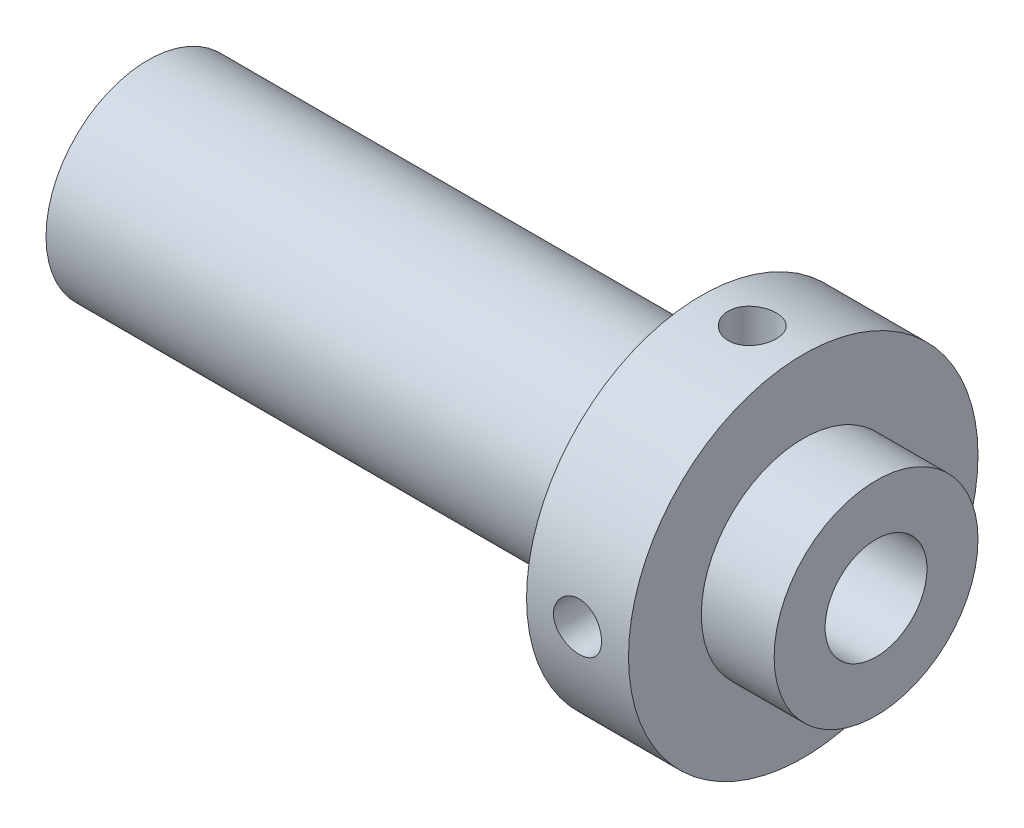
ISO-10303-21;
HEADER;
FILE_DESCRIPTION(('STEP AP214'),'2;1');
FILE_NAME('part.step','',(''),(''),'','','');
FILE_SCHEMA(('AUTOMOTIVE_DESIGN { 1 0 10303 214 1 1 1 1 }'));
ENDSEC;
DATA;
#1=APPLICATION_CONTEXT('core data for automotive mechanical design processes');
#2=APPLICATION_PROTOCOL_DEFINITION('international standard','automotive_design',2000,#1);
#3=PRODUCT_CONTEXT('',#1,'mechanical');
#4=PRODUCT('Part','Part','',(#3));
#5=PRODUCT_RELATED_PRODUCT_CATEGORY('part','',(#4));
#6=PRODUCT_DEFINITION_FORMATION('','',#4);
#7=PRODUCT_DEFINITION_CONTEXT('part definition',#1,'design');
#8=PRODUCT_DEFINITION('design','',#6,#7);
#9=PRODUCT_DEFINITION_SHAPE('','',#8);
#10=(LENGTH_UNIT() NAMED_UNIT(*) SI_UNIT(.MILLI.,.METRE.));
#11=(NAMED_UNIT(*) PLANE_ANGLE_UNIT() SI_UNIT($,.RADIAN.));
#12=(NAMED_UNIT(*) SI_UNIT($,.STERADIAN.) SOLID_ANGLE_UNIT());
#13=UNCERTAINTY_MEASURE_WITH_UNIT(LENGTH_MEASURE(1.E-05),#10,'distance_accuracy_value','');
#14=(GEOMETRIC_REPRESENTATION_CONTEXT(3) GLOBAL_UNCERTAINTY_ASSIGNED_CONTEXT((#13)) GLOBAL_UNIT_ASSIGNED_CONTEXT((#10,
#11,#12)) REPRESENTATION_CONTEXT('',''));
#15=CARTESIAN_POINT('',(0.,0.,0.));
#16=DIRECTION('',(0.,0.,1.));
#17=DIRECTION('',(1.,0.,0.));
#18=AXIS2_PLACEMENT_3D('',#15,#16,#17);
#19=CARTESIAN_POINT('',(-78.343949044586,0.,0.));
#20=DIRECTION('',(-1.,0.,0.));
#21=DIRECTION('',(0.,0.,1.));
#22=AXIS2_PLACEMENT_3D('',#19,#20,#21);
#23=CYLINDRICAL_SURFACE('',#22,12.);
#24=CARTESIAN_POINT('',(-8.5,11.8860212013945,1.64999999999999));
#25=CARTESIAN_POINT('',(-8.59220998360387,11.8860226385264,1.64999613002396));
#26=CARTESIAN_POINT('',(-8.68447564240362,11.887105826869,1.64224418013212));
#27=CARTESIAN_POINT('',(-8.86643352680341,11.8913192881957,1.61144589625372));
#28=CARTESIAN_POINT('',(-8.95612305292578,11.8944516322165,1.58838408858117));
#29=CARTESIAN_POINT('',(-9.13026819658661,11.9024020662651,1.52766373861283));
#30=CARTESIAN_POINT('',(-9.21472753714653,11.907218940567,1.49001572108042));
#31=CARTESIAN_POINT('',(-9.37611600449995,11.9179942416571,1.40121530144305));
#32=CARTESIAN_POINT('',(-9.45304629590715,11.9239524914714,1.35006499244905));
#33=CARTESIAN_POINT('',(-9.59772576563129,11.9363841732149,1.23534295463377));
#34=CARTESIAN_POINT('',(-9.66541679283007,11.9428604946832,1.17169819415429));
#35=CARTESIAN_POINT('',(-9.78919313371306,11.9555727153941,1.03395139464466));
#36=CARTESIAN_POINT('',(-9.84527784157404,11.9618086020727,0.959848810079494));
#37=CARTESIAN_POINT('',(-9.94446115277893,11.9733672599732,0.802920736856224));
#38=CARTESIAN_POINT('',(-9.98750665606202,11.9786862604444,0.720061385959911));
#39=CARTESIAN_POINT('',(-10.0590492420904,11.987779954729,0.548204027714125));
#40=CARTESIAN_POINT('',(-10.087546973665,11.9915547174138,0.459206294336955));
#41=CARTESIAN_POINT('',(-10.1290100274017,11.9971142530275,0.278195499811778));
#42=CARTESIAN_POINT('',(-10.1420724118091,11.9989114564869,0.186205060056939));
#43=CARTESIAN_POINT('',(-10.1525950633701,12.0003559025848,0.00132154623841544));
#44=CARTESIAN_POINT('',(-10.150056065604,12.0000032465168,-0.0915714850925444));
#45=CARTESIAN_POINT('',(-10.1295252428477,11.9971977051282,-0.274962034432946));
#46=CARTESIAN_POINT('',(-10.1116378219599,11.9947590099541,-0.365471488379659));
#47=CARTESIAN_POINT('',(-10.0610814392378,11.9880712548747,-0.542191714384652));
#48=CARTESIAN_POINT('',(-10.0284121476899,11.983822154588,-0.628402390509931));
#49=CARTESIAN_POINT('',(-9.94911034632311,11.9739665629351,-0.794397626155869));
#50=CARTESIAN_POINT('',(-9.90243324383667,11.9683557477435,-0.87416061502739));
#51=CARTESIAN_POINT('',(-9.79647330420027,11.9564033222874,-1.02476103819425));
#52=CARTESIAN_POINT('',(-9.7371897683543,11.9500616715262,-1.0955979774276));
#53=CARTESIAN_POINT('',(-9.60711653318828,11.9372942289596,-1.22694987666085));
#54=CARTESIAN_POINT('',(-9.53623576178698,11.930868174974,-1.28737466116175));
#55=CARTESIAN_POINT('',(-9.38529130216181,11.9187076339264,-1.39548458645316));
#56=CARTESIAN_POINT('',(-9.30522757314208,11.912973149937,-1.44316967064364));
#57=CARTESIAN_POINT('',(-9.13810306397918,11.9028451928452,-1.5244550822645));
#58=CARTESIAN_POINT('',(-9.05103824632493,11.8984525006596,-1.55804721188909));
#59=CARTESIAN_POINT('',(-8.87242916611691,11.8915200104002,-1.61010807759644));
#60=CARTESIAN_POINT('',(-8.78088516703406,11.8889801034827,-1.62857770207284));
#61=CARTESIAN_POINT('',(-8.59671555171758,11.8860610470463,-1.6497478259494));
#62=CARTESIAN_POINT('',(-8.5041048402285,11.8856644486651,-1.6525756709029));
#63=CARTESIAN_POINT('',(-8.31973092436313,11.8870306837085,-1.64271887771972));
#64=CARTESIAN_POINT('',(-8.22796769807643,11.8887934611475,-1.63003464176128));
#65=CARTESIAN_POINT('',(-8.04828134241973,11.8942638562767,-1.58962134728676));
#66=CARTESIAN_POINT('',(-7.96034388590138,11.8979633908859,-1.56195480124171));
#67=CARTESIAN_POINT('',(-7.7903553625703,11.9068838545356,-1.4924269090734));
#68=CARTESIAN_POINT('',(-7.70830454333849,11.9121048475191,-1.45056496634195));
#69=CARTESIAN_POINT('',(-7.55184479040772,11.9235214287447,-1.353524903897));
#70=CARTESIAN_POINT('',(-7.47748777767035,11.9297230041887,-1.2982637871166));
#71=CARTESIAN_POINT('',(-7.33905802200157,11.9423835691543,-1.17611042773872));
#72=CARTESIAN_POINT('',(-7.27498576551034,11.9488425708334,-1.10921763530709));
#73=CARTESIAN_POINT('',(-7.15849218060981,11.9613442783418,-0.965141289202762));
#74=CARTESIAN_POINT('',(-7.10615487543273,11.9673837807676,-0.887889479841925));
#75=CARTESIAN_POINT('',(-7.0152001514837,11.9783172297318,-0.725616987133671));
#76=CARTESIAN_POINT('',(-6.97658240768985,11.9832112034072,-0.640596487889616));
#77=CARTESIAN_POINT('',(-6.91429963349118,11.9912880512405,-0.465471145143463));
#78=CARTESIAN_POINT('',(-6.89058730023259,11.9944763336247,-0.375383384604889));
#79=CARTESIAN_POINT('',(-6.85863492809384,11.9988051451922,-0.192458036311452));
#80=CARTESIAN_POINT('',(-6.85039403720389,11.9999457871387,-0.0996206002667875));
#81=CARTESIAN_POINT('',(-6.84963672731895,12.000049982485,0.0853510273687164));
#82=CARTESIAN_POINT('',(-6.85699123278033,11.9990314067068,0.177484706783051));
#83=CARTESIAN_POINT('',(-6.88694099936655,11.9949673702624,0.359192748630845));
#84=CARTESIAN_POINT('',(-6.90953623306663,11.9919219132435,0.448767115669328));
#85=CARTESIAN_POINT('',(-6.96928295992819,11.9841446870878,0.622788002618762));
#86=CARTESIAN_POINT('',(-7.00642693883851,11.979413788575,0.707237143683854));
#87=CARTESIAN_POINT('',(-7.0942032807651,11.9687875035311,0.868724428360401));
#88=CARTESIAN_POINT('',(-7.14483593869442,11.9628920915401,0.945762409886023));
#89=CARTESIAN_POINT('',(-7.25862494976646,11.9505354189161,1.09089788838674));
#90=CARTESIAN_POINT('',(-7.32187704165669,11.9440700575623,1.15891998091522));
#91=CARTESIAN_POINT('',(-7.45890869626477,11.9313338541327,1.28343299501047));
#92=CARTESIAN_POINT('',(-7.53269073595222,11.9250630582485,1.33992119582806));
#93=CARTESIAN_POINT('',(-7.68908965930991,11.9133946284749,1.43999521477328));
#94=CARTESIAN_POINT('',(-7.77174628065807,11.9080012190855,1.48351940161871));
#95=CARTESIAN_POINT('',(-7.9432274377896,11.8987476677121,1.55600481854412));
#96=CARTESIAN_POINT('',(-8.03204529635082,11.8948858954033,1.58498154220331));
#97=CARTESIAN_POINT('',(-8.18441236346552,11.8900489693475,1.62078358790417));
#98=CARTESIAN_POINT('',(-8.24700951416703,11.8885463079709,1.63172351209082));
#99=CARTESIAN_POINT('',(-8.37306231960142,11.8865319342371,1.64633301403955));
#100=CARTESIAN_POINT('',(-8.43651796576856,11.886020212,1.65000266428797));
#101=CARTESIAN_POINT('',(-8.5,11.8860212013945,1.64999999999999));
#102=B_SPLINE_CURVE_WITH_KNOTS('',3,(#24,#25,#26,#27,#28,#29,#30,#31,#32,#33,#34,#35,#36,#37,
#38,#39,#40,#41,#42,#43,#44,#45,#46,#47,#48,#49,#50,#51,#52,#53,#54,#55,#56,#57,#58,#59,#60,#61,
#62,#63,#64,#65,#66,#67,#68,#69,#70,#71,#72,#73,#74,#75,#76,#77,#78,#79,#80,#81,#82,#83,#84,#85,
#86,#87,#88,#89,#90,#91,#92,#93,#94,#95,#96,#97,#98,#99,#100,#101),.UNSPECIFIED.,.T.,.F.,(4,2,2,
2,2,2,2,2,2,2,2,2,2,2,2,2,2,2,2,2,2,2,2,2,2,2,2,2,2,2,2,2,2,2,2,2,2,2,4),(0.,0.276397983484169,
0.553075748814351,0.829554246407599,1.10598990974025,1.38409225456222,1.66220911202882,
1.94144378337032,2.2206659997822,2.49812287504171,2.77556667764454,3.05113805998517,
3.32671558932151,3.60317987382277,3.87965948501139,4.15842481249812,4.43719137846514,
4.71611987755505,4.99503198940728,5.27166999415775,5.54830082672884,5.82378623413363,
6.09928322115328,6.37653235780657,6.65379460370641,6.93298281479847,7.2121644113692,
7.4904554817475,7.76873122623274,8.0447128105449,8.32069389824655,8.59653263261111,
8.87237739833843,9.15040043279799,9.42848897500458,9.70787919735414,9.98697122429632,
10.1772595261339,10.367545930743),.UNSPECIFIED.);
#103=CARTESIAN_POINT('',(-8.5,11.8860212013945,1.64999999999999));
#104=VERTEX_POINT('',#103);
#105=EDGE_CURVE('E206',#104,#104,#102,.T.);
#106=ORIENTED_EDGE('',*,*,#105,.T.);
#107=EDGE_LOOP('',(#106));
#108=FACE_BOUND('',#107,.T.);
#109=CARTESIAN_POINT('',(-6.85000000000001,0.,12.));
#110=CARTESIAN_POINT('',(-6.85000386594104,-0.0922146289812481,11.9999986127471));
#111=CARTESIAN_POINT('',(-6.8577565705462,-0.184484920071507,11.9989258728383));
#112=CARTESIAN_POINT('',(-6.88855812435204,-0.366452427697861,11.9947497122905));
#113=CARTESIAN_POINT('',(-6.91162243068224,-0.456146948426511,11.9916442396433));
#114=CARTESIAN_POINT('',(-6.97235008859617,-0.63030265815617,11.9837520501673));
#115=CARTESIAN_POINT('',(-7.01000303374883,-0.714767527895527,11.9789665319839));
#116=CARTESIAN_POINT('',(-7.09881506117645,-0.876165277527002,11.9682448465025));
#117=CARTESIAN_POINT('',(-7.14997203843903,-0.953099328765269,11.9623088585784));
#118=CARTESIAN_POINT('',(-7.26470084295284,-1.09777462616961,11.9499038434275));
#119=CARTESIAN_POINT('',(-7.32834420935795,-1.16545889486643,11.9434318750662));
#120=CARTESIAN_POINT('',(-7.4660853732214,-1.289222170742,11.9307077089021));
#121=CARTESIAN_POINT('',(-7.54018373476108,-1.34530055134197,11.9244555229802));
#122=CARTESIAN_POINT('',(-7.69710803522543,-1.44447718783216,11.912850119329));
#123=CARTESIAN_POINT('',(-7.7799685629471,-1.48752119757753,11.9075006984754));
#124=CARTESIAN_POINT('',(-7.95182847654246,-1.55906069875242,11.8983460363033));
#125=CARTESIAN_POINT('',(-8.04082758119011,-1.58755685615948,11.8945407242996));
#126=CARTESIAN_POINT('',(-8.22184287060232,-1.62901670642665,11.8889336744624));
#127=CARTESIAN_POINT('',(-8.31383646845838,-1.64207729481835,11.887119442974));
#128=CARTESIAN_POINT('',(-8.49872618773375,-1.65259525981019,11.8856618999344));
#129=CARTESIAN_POINT('',(-8.59162226525469,-1.65005339158747,11.8860184833132));
#130=CARTESIAN_POINT('',(-8.7750003136044,-1.62951796541692,11.8888508489605));
#131=CARTESIAN_POINT('',(-8.86549455967151,-1.61163170333061,11.8913119152207));
#132=CARTESIAN_POINT('',(-9.04218497052119,-1.56108288681137,11.8980529805222));
#133=CARTESIAN_POINT('',(-9.12838103156903,-1.52841997594227,11.90233302344));
#134=CARTESIAN_POINT('',(-9.29435832301861,-1.44913150550209,11.9122462745274));
#135=CARTESIAN_POINT('',(-9.3741172727656,-1.40245988439688,11.917883934348));
#136=CARTESIAN_POINT('',(-9.52471193044827,-1.29651170810486,11.9298738711198));
#137=CARTESIAN_POINT('',(-9.59554714486961,-1.23723445626869,11.9362261875573));
#138=CARTESIAN_POINT('',(-9.72690592142355,-1.10716575289306,11.9489949290327));
#139=CARTESIAN_POINT('',(-9.78733804601734,-1.03628192792336,11.9554114450232));
#140=CARTESIAN_POINT('',(-9.89546133667235,-0.885328717405433,11.9675359597414));
#141=CARTESIAN_POINT('',(-9.94315246184809,-0.80525930238211,11.9732439561956));
#142=CARTESIAN_POINT('',(-10.0244422502077,-0.638133099611944,11.9833129409823));
#143=CARTESIAN_POINT('',(-10.0580345535145,-0.551073179548476,11.9876733211816));
#144=CARTESIAN_POINT('',(-10.1100972603126,-0.372474767417632,11.9945504954634));
#145=CARTESIAN_POINT('',(-10.1285685215379,-0.280936529692905,11.9970673941156));
#146=CARTESIAN_POINT('',(-10.1497448342996,-0.0967698348872355,11.9999603067613));
#147=CARTESIAN_POINT('',(-10.15257572393,-0.0041561053920499,12.0003534076734));
#148=CARTESIAN_POINT('',(-10.142723943028,0.180224572090858,11.9990007481171));
#149=CARTESIAN_POINT('',(-10.1300416741089,0.271991541938002,11.9972550430191));
#150=CARTESIAN_POINT('',(-10.0896281749537,0.451697751856784,11.9918315150928));
#151=CARTESIAN_POINT('',(-10.0619575712414,0.539650881061892,11.9881614779229));
#152=CARTESIAN_POINT('',(-9.99241633082181,0.709668960478642,11.9792997963918));
#153=CARTESIAN_POINT('',(-9.95054512170446,0.791733673173435,11.9741080906949));
#154=CARTESIAN_POINT('',(-9.85349120295987,0.948203283253755,11.9627383959396));
#155=CARTESIAN_POINT('',(-9.79822784445771,1.02255772028249,11.9565545111617));
#156=CARTESIAN_POINT('',(-9.67607157427388,1.16098123896228,11.9439090328435));
#157=CARTESIAN_POINT('',(-9.6091780995757,1.22504982238391,11.9374474258702));
#158=CARTESIAN_POINT('',(-9.4651032721141,1.34153491040606,11.9249213397593));
#159=CARTESIAN_POINT('',(-9.38785380190632,1.39386754232085,11.9188599248558));
#160=CARTESIAN_POINT('',(-9.22558728728469,1.4848140746248,11.9078727961275));
#161=CARTESIAN_POINT('',(-9.1405704254036,1.52342829729072,11.9029470556242));
#162=CARTESIAN_POINT('',(-8.96544323858307,1.58570885958169,11.8948105300471));
#163=CARTESIAN_POINT('',(-8.87534944821765,1.60942097764743,11.8915944975823));
#164=CARTESIAN_POINT('',(-8.69241133756833,1.64137087823125,11.8872270108171));
#165=CARTESIAN_POINT('',(-8.59956717485086,1.64960954547508,11.8860754384771));
#166=CARTESIAN_POINT('',(-8.41459893230674,1.65036013952322,11.8859711728728));
#167=CARTESIAN_POINT('',(-8.32247537029873,1.64300387550503,11.8870000503082));
#168=CARTESIAN_POINT('',(-8.14078801502411,1.61305414094168,11.8911009295578));
#169=CARTESIAN_POINT('',(-8.05122422010098,1.59046068025722,11.8941729300497));
#170=CARTESIAN_POINT('',(-7.87722535399666,1.53072173773546,11.9020078626982));
#171=CARTESIAN_POINT('',(-7.79278758583554,1.4935839861519,11.9067698964803));
#172=CARTESIAN_POINT('',(-7.6313204647742,1.40582363677465,11.9174496174476));
#173=CARTESIAN_POINT('',(-7.55429128103307,1.35520073117592,11.9233673310108));
#174=CARTESIAN_POINT('',(-7.40915594420492,1.24142272024298,11.9357514020019));
#175=CARTESIAN_POINT('',(-7.34112694523046,1.17816962854011,11.9422218073319));
#176=CARTESIAN_POINT('',(-7.21660046193367,1.04113309580758,11.9549473851292));
#177=CARTESIAN_POINT('',(-7.16010567991804,0.967347193951445,11.9612025068738));
#178=CARTESIAN_POINT('',(-7.06002425380802,0.810944857452888,11.9728250995169));
#179=CARTESIAN_POINT('',(-7.0164981410968,0.72828938885225,11.9781883577829));
#180=CARTESIAN_POINT('',(-6.94400880822639,0.556810616604875,11.9873810709234));
#181=CARTESIAN_POINT('',(-6.91503011639913,0.467993980518666,11.9912121544313));
#182=CARTESIAN_POINT('',(-6.87922275682129,0.315621698417375,11.9960086048462));
#183=CARTESIAN_POINT('',(-6.86828044331205,0.253017739096823,11.9974978989044));
#184=CARTESIAN_POINT('',(-6.85366776907563,0.126951309292061,11.9994940693071));
#185=CARTESIAN_POINT('',(-6.84999733833839,0.0634888470790113,12.0000009551097));
#186=CARTESIAN_POINT('',(-6.85000000000001,0.,12.));
#187=B_SPLINE_CURVE_WITH_KNOTS('',3,(#109,#110,#111,#112,#113,#114,#115,#116,#117,#118,#119,
#120,#121,#122,#123,#124,#125,#126,#127,#128,#129,#130,#131,#132,#133,#134,#135,#136,#137,#138,
#139,#140,#141,#142,#143,#144,#145,#146,#147,#148,#149,#150,#151,#152,#153,#154,#155,#156,#157,
#158,#159,#160,#161,#162,#163,#164,#165,#166,#167,#168,#169,#170,#171,#172,#173,#174,#175,#176,
#177,#178,#179,#180,#181,#182,#183,#184,#185,#186),.UNSPECIFIED.,.T.,.F.,(4,2,2,2,2,2,2,2,2,2,2,
2,2,2,2,2,2,2,2,2,2,2,2,2,2,2,2,2,2,2,2,2,2,2,2,2,2,2,4),(0.,0.276411939973037,
0.553103344203192,0.829597740020915,1.10604906123872,1.38413313785283,1.66223222375805,
1.94147327377358,2.22070153943132,2.4981675014024,2.7756200338024,3.05114814366486,
3.32668290005577,3.60313374608931,3.8795998741332,4.15838402728112,4.43716907502811,
4.71607974588963,4.99497459457913,5.27162222864643,5.5482627008566,5.82379245238593,
6.09933331152155,6.376576646262,6.65383340615322,6.93301259214135,7.21218521913948,
7.49049599653608,7.76879086046826,8.04474294377728,8.32069484850508,8.59650028411022,
8.87231201564514,9.15035304016787,9.42845913127416,9.707843651275,9.9869304036446,
10.177239083925,10.3675459319992),.UNSPECIFIED.);
#188=CARTESIAN_POINT('',(-6.85000000000001,0.,12.));
#189=VERTEX_POINT('',#188);
#190=EDGE_CURVE('E66',#189,#189,#187,.T.);
#191=ORIENTED_EDGE('',*,*,#190,.T.);
#192=EDGE_LOOP('',(#191));
#193=FACE_BOUND('',#192,.T.);
#194=CARTESIAN_POINT('',(-12.,0.,0.));
#195=DIRECTION('',(-1.,0.,0.));
#196=DIRECTION('',(0.,0.,1.));
#197=AXIS2_PLACEMENT_3D('',#194,#195,#196);
#198=CIRCLE('',#197,12.);
#199=CARTESIAN_POINT('',(-12.,0.,12.));
#200=VERTEX_POINT('',#199);
#201=EDGE_CURVE('E11',#200,#200,#198,.T.);
#202=ORIENTED_EDGE('',*,*,#201,.F.);
#203=EDGE_LOOP('',(#202));
#204=FACE_BOUND('',#203,.T.);
#205=CARTESIAN_POINT('',(-5.,0.,0.));
#206=DIRECTION('',(-1.,0.,0.));
#207=DIRECTION('',(0.,0.,1.));
#208=AXIS2_PLACEMENT_3D('',#205,#206,#207);
#209=CIRCLE('',#208,12.);
#210=CARTESIAN_POINT('',(-5.,0.,12.));
#211=VERTEX_POINT('',#210);
#212=EDGE_CURVE('E59',#211,#211,#209,.T.);
#213=ORIENTED_EDGE('',*,*,#212,.T.);
#214=EDGE_LOOP('',(#213));
#215=FACE_BOUND('',#214,.T.);
#216=ADVANCED_FACE('F39',(#108,#193,#204,#215),#23,.T.);
#217=CARTESIAN_POINT('',(-12.,12.,0.));
#218=DIRECTION('',(1.,0.,0.));
#219=DIRECTION('',(0.,0.,-1.));
#220=AXIS2_PLACEMENT_3D('',#217,#218,#219);
#221=PLANE('',#220);
#222=CARTESIAN_POINT('',(-12.,0.,0.));
#223=DIRECTION('',(-1.,0.,0.));
#224=DIRECTION('',(0.,0.,1.));
#225=AXIS2_PLACEMENT_3D('',#222,#223,#224);
#226=CIRCLE('',#225,7.);
#227=CARTESIAN_POINT('',(-12.,0.,7.));
#228=VERTEX_POINT('',#227);
#229=EDGE_CURVE('E46',#228,#228,#226,.T.);
#230=ORIENTED_EDGE('',*,*,#229,.F.);
#231=EDGE_LOOP('',(#230));
#232=FACE_BOUND('',#231,.T.);
#233=ORIENTED_EDGE('',*,*,#201,.T.);
#234=EDGE_LOOP('',(#233));
#235=FACE_BOUND('',#234,.T.);
#236=ADVANCED_FACE('F82',(#232,#235),#221,.F.);
#237=CARTESIAN_POINT('',(-78.343949044586,0.,0.));
#238=DIRECTION('',(-1.,0.,0.));
#239=DIRECTION('',(0.,0.,1.));
#240=AXIS2_PLACEMENT_3D('',#237,#238,#239);
#241=CYLINDRICAL_SURFACE('',#240,7.00000000000001);
#242=CARTESIAN_POINT('',(-50.,0.,0.));
#243=DIRECTION('',(-1.,0.,0.));
#244=DIRECTION('',(0.,0.,1.));
#245=AXIS2_PLACEMENT_3D('',#242,#243,#244);
#246=CIRCLE('',#245,7.00000000000001);
#247=CARTESIAN_POINT('',(-50.,0.,7.00000000000001));
#248=VERTEX_POINT('',#247);
#249=EDGE_CURVE('E75',#248,#248,#246,.T.);
#250=ORIENTED_EDGE('',*,*,#249,.F.);
#251=EDGE_LOOP('',(#250));
#252=FACE_BOUND('',#251,.T.);
#253=ORIENTED_EDGE('',*,*,#229,.T.);
#254=EDGE_LOOP('',(#253));
#255=FACE_BOUND('',#254,.T.);
#256=ADVANCED_FACE('F80',(#252,#255),#241,.T.);
#257=CARTESIAN_POINT('',(-50.,7.00000000000001,0.));
#258=DIRECTION('',(1.,0.,0.));
#259=DIRECTION('',(0.,0.,-1.));
#260=AXIS2_PLACEMENT_3D('',#257,#258,#259);
#261=PLANE('',#260);
#262=ORIENTED_EDGE('',*,*,#249,.T.);
#263=EDGE_LOOP('',(#262));
#264=FACE_BOUND('',#263,.T.);
#265=ADVANCED_FACE('F105',(#264),#261,.F.);
#266=CARTESIAN_POINT('',(0.,7.,0.));
#267=DIRECTION('',(-1.,0.,0.));
#268=DIRECTION('',(0.,0.,1.));
#269=AXIS2_PLACEMENT_3D('',#266,#267,#268);
#270=PLANE('',#269);
#271=CARTESIAN_POINT('',(0.,0.,0.));
#272=DIRECTION('',(1.,0.,0.));
#273=DIRECTION('',(0.,0.,-1.));
#274=AXIS2_PLACEMENT_3D('',#271,#272,#273);
#275=CIRCLE('',#274,3.49999999999999);
#276=CARTESIAN_POINT('',(0.,0.,-3.49999999999999));
#277=VERTEX_POINT('',#276);
#278=EDGE_CURVE('E60',#277,#277,#275,.T.);
#279=ORIENTED_EDGE('',*,*,#278,.F.);
#280=EDGE_LOOP('',(#279));
#281=FACE_BOUND('',#280,.T.);
#282=CARTESIAN_POINT('',(0.,0.,0.));
#283=DIRECTION('',(-1.,0.,0.));
#284=DIRECTION('',(0.,0.,1.));
#285=AXIS2_PLACEMENT_3D('',#282,#283,#284);
#286=CIRCLE('',#285,7.);
#287=CARTESIAN_POINT('',(0.,0.,7.));
#288=VERTEX_POINT('',#287);
#289=EDGE_CURVE('E72',#288,#288,#286,.T.);
#290=ORIENTED_EDGE('',*,*,#289,.F.);
#291=EDGE_LOOP('',(#290));
#292=FACE_BOUND('',#291,.T.);
#293=ADVANCED_FACE('F100',(#281,#292),#270,.F.);
#294=CARTESIAN_POINT('',(-78.343949044586,0.,0.));
#295=DIRECTION('',(-1.,0.,0.));
#296=DIRECTION('',(0.,0.,1.));
#297=AXIS2_PLACEMENT_3D('',#294,#295,#296);
#298=CYLINDRICAL_SURFACE('',#297,7.);
#299=CARTESIAN_POINT('',(-5.,0.,0.));
#300=DIRECTION('',(-1.,0.,0.));
#301=DIRECTION('',(0.,0.,1.));
#302=AXIS2_PLACEMENT_3D('',#299,#300,#301);
#303=CIRCLE('',#302,7.);
#304=CARTESIAN_POINT('',(-5.,0.,7.));
#305=VERTEX_POINT('',#304);
#306=EDGE_CURVE('E63',#305,#305,#303,.T.);
#307=ORIENTED_EDGE('',*,*,#306,.F.);
#308=EDGE_LOOP('',(#307));
#309=FACE_BOUND('',#308,.T.);
#310=ORIENTED_EDGE('',*,*,#289,.T.);
#311=EDGE_LOOP('',(#310));
#312=FACE_BOUND('',#311,.T.);
#313=ADVANCED_FACE('F94',(#309,#312),#298,.T.);
#314=CARTESIAN_POINT('',(-5.,12.,0.));
#315=DIRECTION('',(-1.,0.,0.));
#316=DIRECTION('',(0.,0.,1.));
#317=AXIS2_PLACEMENT_3D('',#314,#315,#316);
#318=PLANE('',#317);
#319=ORIENTED_EDGE('',*,*,#212,.F.);
#320=EDGE_LOOP('',(#319));
#321=FACE_BOUND('',#320,.T.);
#322=ORIENTED_EDGE('',*,*,#306,.T.);
#323=EDGE_LOOP('',(#322));
#324=FACE_BOUND('',#323,.T.);
#325=ADVANCED_FACE('F53',(#321,#324),#318,.F.);
#326=CARTESIAN_POINT('',(-30.,0.,0.));
#327=DIRECTION('',(1.,0.,0.));
#328=DIRECTION('',(0.,0.,-1.));
#329=AXIS2_PLACEMENT_3D('',#326,#327,#328);
#330=CONICAL_SURFACE('',#329,3.49999999999999,1.02974425867665);
#331=CARTESIAN_POINT('',(-32.1030121665965,0.,0.));
#332=VERTEX_POINT('',#331);
#333=VERTEX_LOOP('',#332);
#334=FACE_BOUND('',#333,.T.);
#335=CARTESIAN_POINT('',(-30.,0.,0.));
#336=DIRECTION('',(1.,0.,0.));
#337=DIRECTION('',(0.,0.,-1.));
#338=AXIS2_PLACEMENT_3D('',#335,#336,#337);
#339=CIRCLE('',#338,3.49999999999999);
#340=CARTESIAN_POINT('',(-30.,0.,-3.49999999999999));
#341=VERTEX_POINT('',#340);
#342=EDGE_CURVE('E57',#341,#341,#339,.T.);
#343=ORIENTED_EDGE('',*,*,#342,.T.);
#344=EDGE_LOOP('',(#343));
#345=FACE_BOUND('',#344,.T.);
#346=ADVANCED_FACE('F49',(#334,#345),#330,.F.);
#347=CARTESIAN_POINT('',(0.,0.,0.));
#348=DIRECTION('',(1.,0.,0.));
#349=DIRECTION('',(0.,0.,-1.));
#350=AXIS2_PLACEMENT_3D('',#347,#348,#349);
#351=CYLINDRICAL_SURFACE('',#350,3.49999999999999);
#352=CARTESIAN_POINT('',(-8.5,3.08666486681012,1.64999999999999));
#353=CARTESIAN_POINT('',(-8.41328282012018,3.0866709571615,1.64999479152559));
#354=CARTESIAN_POINT('',(-8.32643951169877,3.09037351498244,1.64311917010406));
#355=CARTESIAN_POINT('',(-8.15535944544857,3.10466741473935,1.61594017509525));
#356=CARTESIAN_POINT('',(-8.07112925515422,3.11527483947665,1.59560545073243));
#357=CARTESIAN_POINT('',(-7.90806567964376,3.1418844933293,1.54254005090177));
#358=CARTESIAN_POINT('',(-7.82920823871923,3.1578604730787,1.50986959628068));
#359=CARTESIAN_POINT('',(-7.67811271389989,3.19336702697671,1.43324257643143));
#360=CARTESIAN_POINT('',(-7.60587432483315,3.21289743712392,1.38928653188195));
#361=CARTESIAN_POINT('',(-7.46423821050148,3.25505760296766,1.28757203290684));
#362=CARTESIAN_POINT('',(-7.39543134760271,3.277809505965,1.22904105315829));
#363=CARTESIAN_POINT('',(-7.26815914399716,3.32285783813508,1.10145044273744));
#364=CARTESIAN_POINT('',(-7.20969849827668,3.34515405648514,1.03238605846692));
#365=CARTESIAN_POINT('',(-7.10145411736865,3.38833627034234,0.880759730913873));
#366=CARTESIAN_POINT('',(-7.05237495413645,3.4090642657127,0.797645619807931));
#367=CARTESIAN_POINT('',(-6.9691608954081,3.44522261935012,0.623182068738582));
#368=CARTESIAN_POINT('',(-6.93501759172494,3.46065595720196,0.531837297271582));
#369=CARTESIAN_POINT('',(-6.88491160400658,3.4836113200968,0.349746078879209));
#370=CARTESIAN_POINT('',(-6.86791908302049,3.49157908807024,0.25934043364646));
#371=CARTESIAN_POINT('',(-6.84922847685118,3.50035341655693,0.0766355594130676));
#372=CARTESIAN_POINT('',(-6.84752228873749,3.5011637710458,-0.015662640378006));
#373=CARTESIAN_POINT('',(-6.85900331681988,3.49576214858116,-0.19188392065505));
#374=CARTESIAN_POINT('',(-6.87104629355309,3.49008965223943,-0.27590160607894));
#375=CARTESIAN_POINT('',(-6.90766751519205,3.47314843980864,-0.440558633120704));
#376=CARTESIAN_POINT('',(-6.93224669170805,3.46187930781501,-0.521197723180943));
#377=CARTESIAN_POINT('',(-6.99346468202144,3.43458721252993,-0.678281789726643));
#378=CARTESIAN_POINT('',(-7.0302766482547,3.41849634000795,-0.754646998999337));
#379=CARTESIAN_POINT('',(-7.11470836486821,3.38305573115681,-0.900312042688027));
#380=CARTESIAN_POINT('',(-7.16233207438741,3.36370480170259,-0.969609275384607));
#381=CARTESIAN_POINT('',(-7.27178483000807,3.32163277838785,-1.1055524409376));
#382=CARTESIAN_POINT('',(-7.33448583055625,3.29876495570559,-1.17145170064296));
#383=CARTESIAN_POINT('',(-7.46994197856231,3.25337494325605,-1.29217626684007));
#384=CARTESIAN_POINT('',(-7.54270333948306,3.23085297672128,-1.34699467768299));
#385=CARTESIAN_POINT('',(-7.70085321714448,3.18748637382309,-1.44673543641312));
#386=CARTESIAN_POINT('',(-7.7866993657966,3.16678809922335,-1.49100179093463));
#387=CARTESIAN_POINT('',(-7.96584449868447,3.131318501035,-1.56413375871306));
#388=CARTESIAN_POINT('',(-8.05913640104116,3.11654162412308,-1.59301381027716));
#389=CARTESIAN_POINT('',(-8.24306189152591,3.09609666976874,-1.63237414801749));
#390=CARTESIAN_POINT('',(-8.33336420630357,3.08982499619896,-1.64407922497873));
#391=CARTESIAN_POINT('',(-8.51484099031466,3.0853706802471,-1.65242776720669));
#392=CARTESIAN_POINT('',(-8.6060149558404,3.08718361820528,-1.64907946178184));
#393=CARTESIAN_POINT('',(-8.77775645530346,3.09805835519912,-1.62853951863229));
#394=CARTESIAN_POINT('',(-8.85852901719926,3.1064390631282,-1.61264761677996));
#395=CARTESIAN_POINT('',(-9.01614163313294,3.12854680278315,-1.56932523908007));
#396=CARTESIAN_POINT('',(-9.09298056299385,3.14227535330334,-1.54189148515407));
#397=CARTESIAN_POINT('',(-9.2445471846354,3.17428766217443,-1.47490049034304));
#398=CARTESIAN_POINT('',(-9.31901382345335,3.19275239185899,-1.4348422149502));
#399=CARTESIAN_POINT('',(-9.46057918226828,3.23196170742215,-1.34419516169739));
#400=CARTESIAN_POINT('',(-9.52767420749225,3.25270742624163,-1.29360113959973));
#401=CARTESIAN_POINT('',(-9.66026152116143,3.29687423205413,-1.17682809276836));
#402=CARTESIAN_POINT('',(-9.72477488081451,3.32033964660897,-1.10954943770382));
#403=CARTESIAN_POINT('',(-9.84185640060636,3.36528643741443,-0.964674240010906));
#404=CARTESIAN_POINT('',(-9.89442185795422,3.38676736409374,-0.88707536907871));
#405=CARTESIAN_POINT('',(-9.98674992592827,3.42580559333623,-0.721915374852485));
#406=CARTESIAN_POINT('',(-10.0262920456294,3.44329392198114,-0.634213593157965));
#407=CARTESIAN_POINT('',(-10.0896971588452,3.47186252870512,-0.45234579528575));
#408=CARTESIAN_POINT('',(-10.1135723631277,3.48294779651025,-0.358184876727253));
#409=CARTESIAN_POINT('',(-10.1431306981481,3.49674509008303,-0.174686495957452));
#410=CARTESIAN_POINT('',(-10.1501836982292,3.5000869329377,-0.0856162289836263));
#411=CARTESIAN_POINT('',(-10.1498091744795,3.4999097071484,0.0924750523871832));
#412=CARTESIAN_POINT('',(-10.1423856581352,3.49639253726241,0.181496073592874));
#413=CARTESIAN_POINT('',(-10.1142224612478,3.48325611545543,0.351913494410197));
#414=CARTESIAN_POINT('',(-10.094226420943,3.4739779728752,0.433461622952168));
#415=CARTESIAN_POINT('',(-10.0424167676221,3.45050976941213,0.591950249839229));
#416=CARTESIAN_POINT('',(-10.0106012668204,3.4363189239048,0.668890009862183));
#417=CARTESIAN_POINT('',(-9.93450982459791,3.40354051448942,0.819845965437452));
#418=CARTESIAN_POINT('',(-9.88973636729701,3.38478343742051,0.893573541369504));
#419=CARTESIAN_POINT('',(-9.78965191312339,3.34493584050476,1.03279050760096));
#420=CARTESIAN_POINT('',(-9.7343361386389,3.32384426452374,1.09827614035439));
#421=CARTESIAN_POINT('',(-9.60898799890276,3.27927189861828,1.22527498184729));
#422=CARTESIAN_POINT('',(-9.53808346080037,3.25574569036112,1.28591415699528));
#423=CARTESIAN_POINT('',(-9.38659214401955,3.21065796223648,1.39468723368166));
#424=CARTESIAN_POINT('',(-9.30599835982624,3.18909788396667,1.44281200657641));
#425=CARTESIAN_POINT('',(-9.13554697347425,3.15030678199402,1.52568075303857));
#426=CARTESIAN_POINT('',(-9.04556338412272,3.13314934453008,1.56020187633335));
#427=CARTESIAN_POINT('',(-8.8600779047041,3.10625652490248,1.61309518095577));
#428=CARTESIAN_POINT('',(-8.76459570452365,3.09649624025458,1.63152157735772));
#429=CARTESIAN_POINT('',(-8.6402515815188,3.08972156913439,1.64426990567832));
#430=CARTESIAN_POINT('',(-8.61226124408024,3.08857839348138,1.64641607824425));
#431=CARTESIAN_POINT('',(-8.55618502192562,3.08704903665555,1.64928200493046));
#432=CARTESIAN_POINT('',(-8.52809913250135,3.086662893342,1.65000168771185));
#433=CARTESIAN_POINT('',(-8.5,3.08666486681012,1.64999999999999));
#434=B_SPLINE_CURVE_WITH_KNOTS('',3,(#352,#353,#354,#355,#356,#357,#358,#359,#360,#361,#362,
#363,#364,#365,#366,#367,#368,#369,#370,#371,#372,#373,#374,#375,#376,#377,#378,#379,#380,#381,
#382,#383,#384,#385,#386,#387,#388,#389,#390,#391,#392,#393,#394,#395,#396,#397,#398,#399,#400,
#401,#402,#403,#404,#405,#406,#407,#408,#409,#410,#411,#412,#413,#414,#415,#416,#417,#418,#419,
#420,#421,#422,#423,#424,#425,#426,#427,#428,#429,#430,#431,#432,#433),.UNSPECIFIED.,.T.,.F.,(4,
2,2,2,2,2,2,2,2,2,2,2,2,2,2,2,2,2,2,2,2,2,2,2,2,2,2,2,2,2,2,2,2,2,2,2,2,2,2,2,4),(0.,
0.260033440005448,0.520674727056864,0.780059724388683,1.0394327567302,1.31771163062619,
1.5961164620595,1.89075241676548,2.18522229114857,2.46071527985323,2.73606222746945,
2.99006511083606,3.24408687282473,3.50186935901178,3.75974639494872,4.03990929177834,
4.32024600176683,4.61503725572308,4.90955139196444,5.18182484349448,5.45394946802867,
5.70107985833366,5.94828048522408,6.20688850896512,6.46562556557438,6.75267754343882,
7.03979439219157,7.33154846904371,7.62307488231298,7.88990316475152,8.15665759247795,
8.4089521068848,8.66128693471073,8.92500898499015,9.18885083536019,9.47620458070266,
9.76376735224236,10.0558624172611,10.3469697231701,10.4312246391361,10.5154837685914),.UNSPECIFIED.);
#435=CARTESIAN_POINT('',(-8.5,3.08666486681012,1.64999999999999));
#436=VERTEX_POINT('',#435);
#437=EDGE_CURVE('E201',#436,#436,#434,.T.);
#438=ORIENTED_EDGE('',*,*,#437,.T.);
#439=EDGE_LOOP('',(#438));
#440=FACE_BOUND('',#439,.T.);
#441=CARTESIAN_POINT('',(-6.85000000000001,0.,3.49999999999999));
#442=CARTESIAN_POINT('',(-6.8500048962657,0.0873268279377621,3.49999586738242));
#443=CARTESIAN_POINT('',(-6.85697354815266,0.174775003472293,3.4966958566096));
#444=CARTESIAN_POINT('',(-6.88455715667685,0.347123420510789,3.48382147200557));
#445=CARTESIAN_POINT('',(-6.90520175988831,0.432017706825883,3.4742334675849));
#446=CARTESIAN_POINT('',(-6.95917073374258,0.596495907740234,3.44979425001381));
#447=CARTESIAN_POINT('',(-6.99244780831281,0.676098344376041,3.43496268285988));
#448=CARTESIAN_POINT('',(-7.07051039592899,0.828489801176204,3.40142631352531));
#449=CARTESIAN_POINT('',(-7.11529412752427,0.901279873647176,3.38272211098969));
#450=CARTESIAN_POINT('',(-7.2179447002635,1.0425326530751,3.34197927445038));
#451=CARTESIAN_POINT('',(-7.27640008660575,1.11053040163451,3.31981313455959));
#452=CARTESIAN_POINT('',(-7.4034777607963,1.23617648383679,3.27510663792718));
#453=CARTESIAN_POINT('',(-7.47210682923485,1.29381785801479,3.25256604058117));
#454=CARTESIAN_POINT('',(-7.62311238588362,1.40096330593764,3.20794237403986));
#455=CARTESIAN_POINT('',(-7.70610141510977,1.44966502932557,3.1859907930362));
#456=CARTESIAN_POINT('',(-7.88025523453223,1.5322156686568,3.14712751333609));
#457=CARTESIAN_POINT('',(-7.97141466538328,1.56607423626943,3.13021254191827));
#458=CARTESIAN_POINT('',(-8.15402057897756,1.61593257103069,3.10475611299988));
#459=CARTESIAN_POINT('',(-8.24516005421847,1.63283299088157,3.09579567979912));
#460=CARTESIAN_POINT('',(-8.42938626007612,1.65107929835658,3.08610694453757));
#461=CARTESIAN_POINT('',(-8.52247136020363,1.65243772525504,3.08537200616094));
#462=CARTESIAN_POINT('',(-8.69763068217,1.64022738774925,3.09187338895172));
#463=CARTESIAN_POINT('',(-8.77984860252737,1.62818686219593,3.09829371805177));
#464=CARTESIAN_POINT('',(-8.94092132611475,1.59213776607365,3.11697050036213));
#465=CARTESIAN_POINT('',(-9.01977523304617,1.56812602728039,3.12922849849391));
#466=CARTESIAN_POINT('',(-9.17408703051078,1.50834869472673,3.15848201386783));
#467=CARTESIAN_POINT('',(-9.2494240563363,1.47232388676647,3.17558062785176));
#468=CARTESIAN_POINT('',(-9.39332463772983,1.3897342422579,3.21258211770392));
#469=CARTESIAN_POINT('',(-9.46188519610062,1.3431647715608,3.2324862250689));
#470=CARTESIAN_POINT('',(-9.59830359988061,1.23476185583674,3.27553425648672));
#471=CARTESIAN_POINT('',(-9.66523764370733,1.17180756272316,3.29879248271025));
#472=CARTESIAN_POINT('',(-9.78795679149433,1.03541627388648,3.34411071821351));
#473=CARTESIAN_POINT('',(-9.843737650223,0.961975304787416,3.36617026892423));
#474=CARTESIAN_POINT('',(-9.94447481097861,0.803210922468435,3.40761196200502));
#475=CARTESIAN_POINT('',(-9.98895374928325,0.717548187821264,3.42686469917372));
#476=CARTESIAN_POINT('',(-10.0625294671082,0.538815693880731,3.4594659516184));
#477=CARTESIAN_POINT('',(-10.0916371533122,0.445751240577484,3.47281865216851));
#478=CARTESIAN_POINT('',(-10.1314765697913,0.262481014855953,3.49126490063429));
#479=CARTESIAN_POINT('',(-10.1434413136631,0.172599230233145,3.49691105810484));
#480=CARTESIAN_POINT('',(-10.1524541909827,-0.00806100007144722,3.50115490188956));
#481=CARTESIAN_POINT('',(-10.1495082811366,-0.0988390732290235,3.49975540289744));
#482=CARTESIAN_POINT('',(-10.1295650985566,-0.272258269574313,3.49040346252514));
#483=CARTESIAN_POINT('',(-10.1135241851233,-0.355036592203248,3.4828971409527));
#484=CARTESIAN_POINT('',(-10.0692845484582,-0.516587504601427,3.4626245410577));
#485=CARTESIAN_POINT('',(-10.0410844140439,-0.595359628229984,3.44985765220848));
#486=CARTESIAN_POINT('',(-9.97248603112069,-0.749407922823943,3.41975704421133));
#487=CARTESIAN_POINT('',(-9.93174255517083,-0.824504650131206,3.4022961235053));
#488=CARTESIAN_POINT('',(-9.83959232310271,-0.967059749723547,3.36455669068654));
#489=CARTESIAN_POINT('',(-9.78818088646354,-1.03451474908349,3.34427694311963));
#490=CARTESIAN_POINT('',(-9.67082713793909,-1.16624336689728,3.30077375801457));
#491=CARTESIAN_POINT('',(-9.60399700178652,-1.22969440736721,3.27744919463594));
#492=CARTESIAN_POINT('',(-9.460454418059,-1.34480366789696,3.23192555891239));
#493=CARTESIAN_POINT('',(-9.383736999963,-1.3964559200285,3.20972706053723));
#494=CARTESIAN_POINT('',(-9.21915524104497,-1.48811445053865,3.1683021956523));
#495=CARTESIAN_POINT('',(-9.13099749914204,-1.52765708639659,3.14920490119097));
#496=CARTESIAN_POINT('',(-8.94807829091736,-1.59093161547004,3.11772452710617));
#497=CARTESIAN_POINT('',(-8.85332444608329,-1.61468143226737,3.10533383900547));
#498=CARTESIAN_POINT('',(-8.66918355675797,-1.64370223580338,3.09006269265965));
#499=CARTESIAN_POINT('',(-8.58009472729428,-1.65046042900548,3.08641822939854));
#500=CARTESIAN_POINT('',(-8.4020316743025,-1.64949116738445,3.08693737833868));
#501=CARTESIAN_POINT('',(-8.31305742450598,-1.64176803511748,3.09109866058946));
#502=CARTESIAN_POINT('',(-8.14481315972655,-1.61340307685817,3.10598654604961));
#503=CARTESIAN_POINT('',(-8.06531898243453,-1.59378562331039,3.1161911999594));
#504=CARTESIAN_POINT('',(-7.91079427542057,-1.54335574133227,3.14147162704018));
#505=CARTESIAN_POINT('',(-7.83576509401948,-1.51253995103856,3.15654886286303));
#506=CARTESIAN_POINT('',(-7.68680615621605,-1.43826220216967,3.19110997973678));
#507=CARTESIAN_POINT('',(-7.61328195684584,-1.39409504926621,3.21082036763064));
#508=CARTESIAN_POINT('',(-7.47423179220147,-1.29521645110347,3.25196569198876));
#509=CARTESIAN_POINT('',(-7.40870966012802,-1.24049998455551,3.27340144685584));
#510=CARTESIAN_POINT('',(-7.28051164642523,-1.11542413893337,3.31823436973911));
#511=CARTESIAN_POINT('',(-7.21882802350708,-1.04403296913581,3.34160555443513));
#512=CARTESIAN_POINT('',(-7.10815531970928,-0.891162614922434,3.38557944776079));
#513=CARTESIAN_POINT('',(-7.05917235882126,-0.809678594967037,3.40618081942379));
#514=CARTESIAN_POINT('',(-6.97576381018511,-0.638905749496307,3.44229372001401));
#515=CARTESIAN_POINT('',(-6.94128313861093,-0.549648039966638,3.45782445739751));
#516=CARTESIAN_POINT('',(-6.88823344530436,-0.365794568969736,3.48205775825636));
#517=CARTESIAN_POINT('',(-6.86961734746272,-0.271215494683328,3.4907805170161));
#518=CARTESIAN_POINT('',(-6.85625693641085,-0.146544894254572,3.49705432215177));
#519=CARTESIAN_POINT('',(-6.85391323129692,-0.117300423249608,3.49815665586069));
#520=CARTESIAN_POINT('',(-6.85078392312625,-0.0587085422054084,3.49963019742884));
#521=CARTESIAN_POINT('',(-6.84999835377174,-0.0293611299533234,3.50000138947359));
#522=CARTESIAN_POINT('',(-6.85000000000001,0.,3.49999999999999));
#523=B_SPLINE_CURVE_WITH_KNOTS('',3,(#441,#442,#443,#444,#445,#446,#447,#448,#449,#450,#451,
#452,#453,#454,#455,#456,#457,#458,#459,#460,#461,#462,#463,#464,#465,#466,#467,#468,#469,#470,
#471,#472,#473,#474,#475,#476,#477,#478,#479,#480,#481,#482,#483,#484,#485,#486,#487,#488,#489,
#490,#491,#492,#493,#494,#495,#496,#497,#498,#499,#500,#501,#502,#503,#504,#505,#506,#507,#508,
#509,#510,#511,#512,#513,#514,#515,#516,#517,#518,#519,#520,#521,#522),.UNSPECIFIED.,.T.,.F.,(4,
2,2,2,2,2,2,2,2,2,2,2,2,2,2,2,2,2,2,2,2,2,2,2,2,2,2,2,2,2,2,2,2,2,2,2,2,2,2,2,4),(0.,
0.261860613612079,0.524290751508812,0.785747887475132,1.0471645692388,1.32310205177279,
1.59922427585058,1.89381880925412,2.18822149923866,2.4659964058955,2.74354718803913,
2.99241265550521,3.24134402109566,3.49603770076012,3.75084353073187,4.03394985814706,
4.31716373990992,4.61086583668043,4.90435925593913,5.17545103688841,5.44643452703941,
5.69923035146878,5.95205552293811,6.21257782423225,6.47321467114718,6.75713599598189,
7.04120061421922,7.3350725083405,7.62861030961831,7.8953883594889,8.16208679098919,
8.40855507463426,8.655097411968,8.91804921821686,9.18112649530591,9.47136458262489,
9.7617422664017,10.0510068287674,10.3394100163834,10.4274511990454,10.5154942860038),.UNSPECIFIED.);
#524=CARTESIAN_POINT('',(-6.85000000000001,0.,3.49999999999999));
#525=VERTEX_POINT('',#524);
#526=EDGE_CURVE('E212',#525,#525,#523,.T.);
#527=ORIENTED_EDGE('',*,*,#526,.T.);
#528=EDGE_LOOP('',(#527));
#529=FACE_BOUND('',#528,.T.);
#530=ORIENTED_EDGE('',*,*,#342,.F.);
#531=EDGE_LOOP('',(#530));
#532=FACE_BOUND('',#531,.T.);
#533=ORIENTED_EDGE('',*,*,#278,.T.);
#534=EDGE_LOOP('',(#533));
#535=FACE_BOUND('',#534,.T.);
#536=ADVANCED_FACE('F52',(#440,#529,#532,#535),#351,.F.);
#537=CARTESIAN_POINT('',(-8.5,0.,12.));
#538=DIRECTION('',(0.,0.,1.));
#539=DIRECTION('',(1.,0.,0.));
#540=AXIS2_PLACEMENT_3D('',#537,#538,#539);
#541=CYLINDRICAL_SURFACE('',#540,1.64999999999999);
#542=ORIENTED_EDGE('',*,*,#526,.F.);
#543=EDGE_LOOP('',(#542));
#544=FACE_BOUND('',#543,.T.);
#545=ORIENTED_EDGE('',*,*,#190,.F.);
#546=EDGE_LOOP('',(#545));
#547=FACE_BOUND('',#546,.T.);
#548=ADVANCED_FACE('F155',(#544,#547),#541,.F.);
#549=CARTESIAN_POINT('',(-8.5,12.,0.));
#550=DIRECTION('',(0.,1.,0.));
#551=DIRECTION('',(0.,0.,1.));
#552=AXIS2_PLACEMENT_3D('',#549,#550,#551);
#553=CYLINDRICAL_SURFACE('',#552,1.64999999999999);
#554=ORIENTED_EDGE('',*,*,#437,.F.);
#555=EDGE_LOOP('',(#554));
#556=FACE_BOUND('',#555,.T.);
#557=ORIENTED_EDGE('',*,*,#105,.F.);
#558=EDGE_LOOP('',(#557));
#559=FACE_BOUND('',#558,.T.);
#560=ADVANCED_FACE('F161',(#556,#559),#553,.F.);
#561=CLOSED_SHELL('',(#216,#236,#256,#265,#293,#313,#325,#346,#536,#548,#560));
#562=MANIFOLD_SOLID_BREP('B2',#561);
#563=ADVANCED_BREP_SHAPE_REPRESENTATION('',(#18,#562),#14);
#564=SHAPE_DEFINITION_REPRESENTATION(#9,#563);
ENDSEC;
END-ISO-10303-21;
